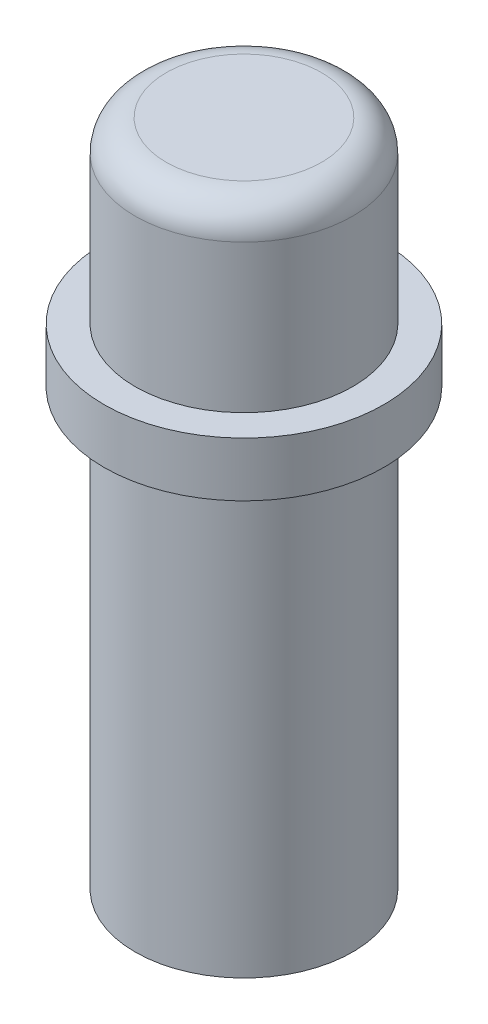
ISO-10303-21;
HEADER;
FILE_DESCRIPTION(('STEP AP214'),'2;1');
FILE_NAME('part.step','',(''),(''),'','','');
FILE_SCHEMA(('AUTOMOTIVE_DESIGN { 1 0 10303 214 1 1 1 1 }'));
ENDSEC;
DATA;
#1=APPLICATION_CONTEXT('core data for automotive mechanical design processes');
#2=APPLICATION_PROTOCOL_DEFINITION('international standard','automotive_design',2000,#1);
#3=PRODUCT_CONTEXT('',#1,'mechanical');
#4=PRODUCT('Part','Part','',(#3));
#5=PRODUCT_RELATED_PRODUCT_CATEGORY('part','',(#4));
#6=PRODUCT_DEFINITION_FORMATION('','',#4);
#7=PRODUCT_DEFINITION_CONTEXT('part definition',#1,'design');
#8=PRODUCT_DEFINITION('design','',#6,#7);
#9=PRODUCT_DEFINITION_SHAPE('','',#8);
#10=(LENGTH_UNIT() NAMED_UNIT(*) SI_UNIT(.MILLI.,.METRE.));
#11=(NAMED_UNIT(*) PLANE_ANGLE_UNIT() SI_UNIT($,.RADIAN.));
#12=(NAMED_UNIT(*) SI_UNIT($,.STERADIAN.) SOLID_ANGLE_UNIT());
#13=UNCERTAINTY_MEASURE_WITH_UNIT(LENGTH_MEASURE(1.E-05),#10,'distance_accuracy_value','');
#14=(GEOMETRIC_REPRESENTATION_CONTEXT(3) GLOBAL_UNCERTAINTY_ASSIGNED_CONTEXT((#13)) GLOBAL_UNIT_ASSIGNED_CONTEXT((#10,
#11,#12)) REPRESENTATION_CONTEXT('',''));
#15=CARTESIAN_POINT('',(0.,0.,0.));
#16=DIRECTION('',(0.,0.,1.));
#17=DIRECTION('',(1.,0.,0.));
#18=AXIS2_PLACEMENT_3D('',#15,#16,#17);
#19=CARTESIAN_POINT('',(0.,14.,0.));
#20=DIRECTION('',(0.,-1.,0.));
#21=DIRECTION('',(0.,0.,-1.));
#22=AXIS2_PLACEMENT_3D('',#19,#20,#21);
#23=CYLINDRICAL_SURFACE('',#22,3.5);
#24=CARTESIAN_POINT('',(0.,14.,0.));
#25=DIRECTION('',(0.,1.,0.));
#26=DIRECTION('',(0.,0.,1.));
#27=AXIS2_PLACEMENT_3D('',#24,#25,#26);
#28=CIRCLE('',#27,3.5);
#29=CARTESIAN_POINT('',(0.,14.,3.5));
#30=VERTEX_POINT('',#29);
#31=EDGE_CURVE('E57',#30,#30,#28,.T.);
#32=ORIENTED_EDGE('',*,*,#31,.F.);
#33=EDGE_LOOP('',(#32));
#34=FACE_BOUND('',#33,.T.);
#35=CARTESIAN_POINT('',(0.,0.,0.));
#36=DIRECTION('',(0.,1.,0.));
#37=DIRECTION('',(0.,0.,1.));
#38=AXIS2_PLACEMENT_3D('',#35,#36,#37);
#39=CIRCLE('',#38,3.5);
#40=CARTESIAN_POINT('',(0.,0.,3.5));
#41=VERTEX_POINT('',#40);
#42=EDGE_CURVE('E60',#41,#41,#39,.T.);
#43=ORIENTED_EDGE('',*,*,#42,.T.);
#44=EDGE_LOOP('',(#43));
#45=FACE_BOUND('',#44,.T.);
#46=ADVANCED_FACE('F39',(#34,#45),#23,.T.);
#47=CARTESIAN_POINT('',(0.,0.,0.));
#48=DIRECTION('',(0.,1.,0.));
#49=DIRECTION('',(0.,0.,1.));
#50=AXIS2_PLACEMENT_3D('',#47,#48,#49);
#51=PLANE('',#50);
#52=CARTESIAN_POINT('',(0.,0.,0.));
#53=DIRECTION('',(0.,-1.,0.));
#54=DIRECTION('',(0.,0.,-1.));
#55=AXIS2_PLACEMENT_3D('',#52,#53,#54);
#56=CIRCLE('',#55,2.);
#57=CARTESIAN_POINT('',(0.,0.,-2.));
#58=VERTEX_POINT('',#57);
#59=EDGE_CURVE('E76',#58,#58,#56,.T.);
#60=ORIENTED_EDGE('',*,*,#59,.F.);
#61=EDGE_LOOP('',(#60));
#62=FACE_BOUND('',#61,.T.);
#63=ORIENTED_EDGE('',*,*,#42,.F.);
#64=EDGE_LOOP('',(#63));
#65=FACE_BOUND('',#64,.T.);
#66=ADVANCED_FACE('F92',(#62,#65),#51,.F.);
#67=CARTESIAN_POINT('',(0.,15.75,0.));
#68=DIRECTION('',(0.,-1.,0.));
#69=DIRECTION('',(0.,0.,-1.));
#70=AXIS2_PLACEMENT_3D('',#67,#68,#69);
#71=CYLINDRICAL_SURFACE('',#70,4.5);
#72=CARTESIAN_POINT('',(0.,15.75,0.));
#73=DIRECTION('',(0.,1.,0.));
#74=DIRECTION('',(0.,0.,1.));
#75=AXIS2_PLACEMENT_3D('',#72,#73,#74);
#76=CIRCLE('',#75,4.5);
#77=CARTESIAN_POINT('',(0.,15.75,4.5));
#78=VERTEX_POINT('',#77);
#79=EDGE_CURVE('E64',#78,#78,#76,.T.);
#80=ORIENTED_EDGE('',*,*,#79,.F.);
#81=EDGE_LOOP('',(#80));
#82=FACE_BOUND('',#81,.T.);
#83=CARTESIAN_POINT('',(0.,14.,0.));
#84=DIRECTION('',(0.,1.,0.));
#85=DIRECTION('',(0.,0.,1.));
#86=AXIS2_PLACEMENT_3D('',#83,#84,#85);
#87=CIRCLE('',#86,4.5);
#88=CARTESIAN_POINT('',(0.,14.,4.5));
#89=VERTEX_POINT('',#88);
#90=EDGE_CURVE('E68',#89,#89,#87,.T.);
#91=ORIENTED_EDGE('',*,*,#90,.T.);
#92=EDGE_LOOP('',(#91));
#93=FACE_BOUND('',#92,.T.);
#94=ADVANCED_FACE('F95',(#82,#93),#71,.T.);
#95=CARTESIAN_POINT('',(0.,15.75,0.));
#96=DIRECTION('',(0.,1.,0.));
#97=DIRECTION('',(0.,0.,1.));
#98=AXIS2_PLACEMENT_3D('',#95,#96,#97);
#99=PLANE('',#98);
#100=CARTESIAN_POINT('',(0.,15.75,0.));
#101=DIRECTION('',(0.,1.,0.));
#102=DIRECTION('',(0.,0.,1.));
#103=AXIS2_PLACEMENT_3D('',#100,#101,#102);
#104=CIRCLE('',#103,3.5);
#105=CARTESIAN_POINT('',(0.,15.75,3.5));
#106=VERTEX_POINT('',#105);
#107=EDGE_CURVE('E52',#106,#106,#104,.T.);
#108=ORIENTED_EDGE('',*,*,#107,.F.);
#109=EDGE_LOOP('',(#108));
#110=FACE_BOUND('',#109,.T.);
#111=ORIENTED_EDGE('',*,*,#79,.T.);
#112=EDGE_LOOP('',(#111));
#113=FACE_BOUND('',#112,.T.);
#114=ADVANCED_FACE('F107',(#110,#113),#99,.T.);
#115=CARTESIAN_POINT('',(0.,14.,0.));
#116=DIRECTION('',(0.,1.,0.));
#117=DIRECTION('',(0.,0.,1.));
#118=AXIS2_PLACEMENT_3D('',#115,#116,#117);
#119=PLANE('',#118);
#120=ORIENTED_EDGE('',*,*,#31,.T.);
#121=EDGE_LOOP('',(#120));
#122=FACE_BOUND('',#121,.T.);
#123=ORIENTED_EDGE('',*,*,#90,.F.);
#124=EDGE_LOOP('',(#123));
#125=FACE_BOUND('',#124,.T.);
#126=ADVANCED_FACE('F109',(#122,#125),#119,.F.);
#127=CARTESIAN_POINT('',(0.,21.5,0.));
#128=DIRECTION('',(0.,-1.,0.));
#129=DIRECTION('',(0.,0.,-1.));
#130=AXIS2_PLACEMENT_3D('',#127,#128,#129);
#131=CYLINDRICAL_SURFACE('',#130,3.5);
#132=CARTESIAN_POINT('',(0.,20.5,0.));
#133=DIRECTION('',(0.,1.,0.));
#134=DIRECTION('',(0.,0.,1.));
#135=AXIS2_PLACEMENT_3D('',#132,#133,#134);
#136=CIRCLE('',#135,3.5);
#137=CARTESIAN_POINT('',(0.,20.5,3.5));
#138=VERTEX_POINT('',#137);
#139=EDGE_CURVE('E10',#138,#138,#136,.F.);
#140=ORIENTED_EDGE('',*,*,#139,.T.);
#141=EDGE_LOOP('',(#140));
#142=FACE_BOUND('',#141,.T.);
#143=ORIENTED_EDGE('',*,*,#107,.T.);
#144=EDGE_LOOP('',(#143));
#145=FACE_BOUND('',#144,.T.);
#146=ADVANCED_FACE('F112',(#142,#145),#131,.T.);
#147=CARTESIAN_POINT('',(0.,21.5,0.));
#148=DIRECTION('',(0.,1.,0.));
#149=DIRECTION('',(0.,0.,1.));
#150=AXIS2_PLACEMENT_3D('',#147,#148,#149);
#151=PLANE('',#150);
#152=CARTESIAN_POINT('',(0.,21.5,0.));
#153=DIRECTION('',(0.,1.,0.));
#154=DIRECTION('',(0.,0.,1.));
#155=AXIS2_PLACEMENT_3D('',#152,#153,#154);
#156=CIRCLE('',#155,2.5);
#157=CARTESIAN_POINT('',(0.,21.5,2.5));
#158=VERTEX_POINT('',#157);
#159=EDGE_CURVE('E47',#158,#158,#156,.T.);
#160=ORIENTED_EDGE('',*,*,#159,.T.);
#161=EDGE_LOOP('',(#160));
#162=FACE_BOUND('',#161,.T.);
#163=ADVANCED_FACE('F119',(#162),#151,.T.);
#164=CARTESIAN_POINT('',(0.,20.5,0.));
#165=DIRECTION('',(0.,1.,0.));
#166=DIRECTION('',(0.,0.,1.));
#167=AXIS2_PLACEMENT_3D('',#164,#165,#166);
#168=TOROIDAL_SURFACE('',#167,2.5,1.);
#169=ORIENTED_EDGE('',*,*,#139,.F.);
#170=EDGE_LOOP('',(#169));
#171=FACE_BOUND('',#170,.T.);
#172=ORIENTED_EDGE('',*,*,#159,.F.);
#173=EDGE_LOOP('',(#172));
#174=FACE_BOUND('',#173,.T.);
#175=ADVANCED_FACE('F41',(#171,#174),#168,.T.);
#176=CARTESIAN_POINT('',(0.,0.5,0.));
#177=DIRECTION('',(0.,-1.,0.));
#178=DIRECTION('',(0.,0.,-1.));
#179=AXIS2_PLACEMENT_3D('',#176,#177,#178);
#180=CYLINDRICAL_SURFACE('',#179,2.);
#181=CARTESIAN_POINT('',(0.,0.5,0.));
#182=DIRECTION('',(0.,-1.,0.));
#183=DIRECTION('',(0.,0.,-1.));
#184=AXIS2_PLACEMENT_3D('',#181,#182,#183);
#185=CIRCLE('',#184,2.);
#186=CARTESIAN_POINT('',(0.,0.5,-2.));
#187=VERTEX_POINT('',#186);
#188=EDGE_CURVE('E72',#187,#187,#185,.T.);
#189=ORIENTED_EDGE('',*,*,#188,.F.);
#190=EDGE_LOOP('',(#189));
#191=FACE_BOUND('',#190,.T.);
#192=ORIENTED_EDGE('',*,*,#59,.T.);
#193=EDGE_LOOP('',(#192));
#194=FACE_BOUND('',#193,.T.);
#195=ADVANCED_FACE('F86',(#191,#194),#180,.F.);
#196=CARTESIAN_POINT('',(0.,0.5,0.));
#197=DIRECTION('',(0.,-1.,0.));
#198=DIRECTION('',(0.,0.,-1.));
#199=AXIS2_PLACEMENT_3D('',#196,#197,#198);
#200=PLANE('',#199);
#201=ORIENTED_EDGE('',*,*,#188,.T.);
#202=EDGE_LOOP('',(#201));
#203=FACE_BOUND('',#202,.T.);
#204=ADVANCED_FACE('F84',(#203),#200,.T.);
#205=CLOSED_SHELL('',(#46,#66,#94,#114,#126,#146,#163,#175,#195,#204));
#206=MANIFOLD_SOLID_BREP('B2',#205);
#207=ADVANCED_BREP_SHAPE_REPRESENTATION('',(#18,#206),#14);
#208=SHAPE_DEFINITION_REPRESENTATION(#9,#207);
ENDSEC;
END-ISO-10303-21;
